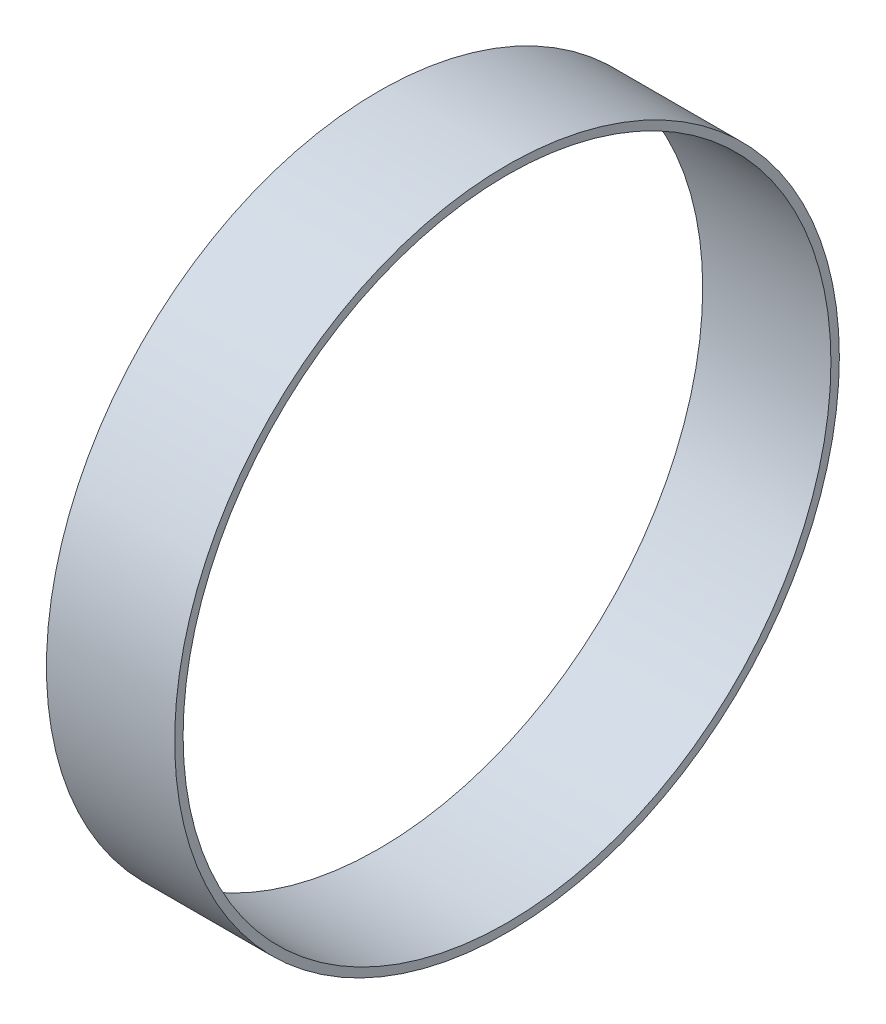
ISO-10303-21;
HEADER;
FILE_DESCRIPTION(('STEP AP214'),'2;1');
FILE_NAME('part.step','',(''),(''),'','','');
FILE_SCHEMA(('AUTOMOTIVE_DESIGN { 1 0 10303 214 1 1 1 1 }'));
ENDSEC;
DATA;
#1=APPLICATION_CONTEXT('core data for automotive mechanical design processes');
#2=APPLICATION_PROTOCOL_DEFINITION('international standard','automotive_design',2000,#1);
#3=PRODUCT_CONTEXT('',#1,'mechanical');
#4=PRODUCT('Part','Part','',(#3));
#5=PRODUCT_RELATED_PRODUCT_CATEGORY('part','',(#4));
#6=PRODUCT_DEFINITION_FORMATION('','',#4);
#7=PRODUCT_DEFINITION_CONTEXT('part definition',#1,'design');
#8=PRODUCT_DEFINITION('design','',#6,#7);
#9=PRODUCT_DEFINITION_SHAPE('','',#8);
#10=(LENGTH_UNIT() NAMED_UNIT(*) SI_UNIT(.MILLI.,.METRE.));
#11=(NAMED_UNIT(*) PLANE_ANGLE_UNIT() SI_UNIT($,.RADIAN.));
#12=(NAMED_UNIT(*) SI_UNIT($,.STERADIAN.) SOLID_ANGLE_UNIT());
#13=UNCERTAINTY_MEASURE_WITH_UNIT(LENGTH_MEASURE(1.E-05),#10,'distance_accuracy_value','');
#14=(GEOMETRIC_REPRESENTATION_CONTEXT(3) GLOBAL_UNCERTAINTY_ASSIGNED_CONTEXT((#13)) GLOBAL_UNIT_ASSIGNED_CONTEXT((#10,
#11,#12)) REPRESENTATION_CONTEXT('',''));
#15=CARTESIAN_POINT('',(0.,0.,0.));
#16=DIRECTION('',(0.,0.,1.));
#17=DIRECTION('',(1.,0.,0.));
#18=AXIS2_PLACEMENT_3D('',#15,#16,#17);
#19=CARTESIAN_POINT('',(38.,0.,0.));
#20=DIRECTION('',(1.,0.,0.));
#21=DIRECTION('',(0.,0.,-1.));
#22=AXIS2_PLACEMENT_3D('',#19,#20,#21);
#23=PLANE('',#22);
#24=CARTESIAN_POINT('',(38.,0.,0.));
#25=DIRECTION('',(1.,0.,0.));
#26=DIRECTION('',(0.,0.,-1.));
#27=AXIS2_PLACEMENT_3D('',#24,#25,#26);
#28=CIRCLE('',#27,98.5);
#29=CARTESIAN_POINT('',(38.,0.,-98.5));
#30=VERTEX_POINT('',#29);
#31=EDGE_CURVE('E10',#30,#30,#28,.T.);
#32=ORIENTED_EDGE('',*,*,#31,.T.);
#33=EDGE_LOOP('',(#32));
#34=FACE_BOUND('',#33,.T.);
#35=CARTESIAN_POINT('',(38.,0.,0.));
#36=DIRECTION('',(1.,0.,0.));
#37=DIRECTION('',(0.,0.,-1.));
#38=AXIS2_PLACEMENT_3D('',#35,#36,#37);
#39=CIRCLE('',#38,96.);
#40=CARTESIAN_POINT('',(38.,0.,-96.));
#41=VERTEX_POINT('',#40);
#42=EDGE_CURVE('E42',#41,#41,#39,.T.);
#43=ORIENTED_EDGE('',*,*,#42,.F.);
#44=EDGE_LOOP('',(#43));
#45=FACE_BOUND('',#44,.T.);
#46=ADVANCED_FACE('F31',(#34,#45),#23,.T.);
#47=CARTESIAN_POINT('',(0.,0.,0.));
#48=DIRECTION('',(1.,0.,0.));
#49=DIRECTION('',(0.,0.,-1.));
#50=AXIS2_PLACEMENT_3D('',#47,#48,#49);
#51=PLANE('',#50);
#52=CARTESIAN_POINT('',(0.,0.,0.));
#53=DIRECTION('',(1.,0.,0.));
#54=DIRECTION('',(0.,0.,-1.));
#55=AXIS2_PLACEMENT_3D('',#52,#53,#54);
#56=CIRCLE('',#55,98.5);
#57=CARTESIAN_POINT('',(0.,0.,-98.5));
#58=VERTEX_POINT('',#57);
#59=EDGE_CURVE('E35',#58,#58,#56,.T.);
#60=ORIENTED_EDGE('',*,*,#59,.F.);
#61=EDGE_LOOP('',(#60));
#62=FACE_BOUND('',#61,.T.);
#63=CARTESIAN_POINT('',(0.,0.,0.));
#64=DIRECTION('',(1.,0.,0.));
#65=DIRECTION('',(0.,0.,-1.));
#66=AXIS2_PLACEMENT_3D('',#63,#64,#65);
#67=CIRCLE('',#66,96.);
#68=CARTESIAN_POINT('',(0.,0.,-96.));
#69=VERTEX_POINT('',#68);
#70=EDGE_CURVE('E44',#69,#69,#67,.T.);
#71=ORIENTED_EDGE('',*,*,#70,.T.);
#72=EDGE_LOOP('',(#71));
#73=FACE_BOUND('',#72,.T.);
#74=ADVANCED_FACE('F54',(#62,#73),#51,.F.);
#75=CARTESIAN_POINT('',(38.,0.,0.));
#76=DIRECTION('',(-1.,0.,0.));
#77=DIRECTION('',(0.,0.,1.));
#78=AXIS2_PLACEMENT_3D('',#75,#76,#77);
#79=CYLINDRICAL_SURFACE('',#78,98.5);
#80=ORIENTED_EDGE('',*,*,#31,.F.);
#81=EDGE_LOOP('',(#80));
#82=FACE_BOUND('',#81,.T.);
#83=ORIENTED_EDGE('',*,*,#59,.T.);
#84=EDGE_LOOP('',(#83));
#85=FACE_BOUND('',#84,.T.);
#86=ADVANCED_FACE('F33',(#82,#85),#79,.T.);
#87=CARTESIAN_POINT('',(38.,0.,0.));
#88=DIRECTION('',(-1.,0.,0.));
#89=DIRECTION('',(0.,0.,1.));
#90=AXIS2_PLACEMENT_3D('',#87,#88,#89);
#91=CYLINDRICAL_SURFACE('',#90,96.);
#92=ORIENTED_EDGE('',*,*,#42,.T.);
#93=EDGE_LOOP('',(#92));
#94=FACE_BOUND('',#93,.T.);
#95=ORIENTED_EDGE('',*,*,#70,.F.);
#96=EDGE_LOOP('',(#95));
#97=FACE_BOUND('',#96,.T.);
#98=ADVANCED_FACE('F50',(#94,#97),#91,.F.);
#99=CLOSED_SHELL('',(#46,#74,#86,#98));
#100=MANIFOLD_SOLID_BREP('B2',#99);
#101=ADVANCED_BREP_SHAPE_REPRESENTATION('',(#18,#100),#14);
#102=SHAPE_DEFINITION_REPRESENTATION(#9,#101);
ENDSEC;
END-ISO-10303-21;
